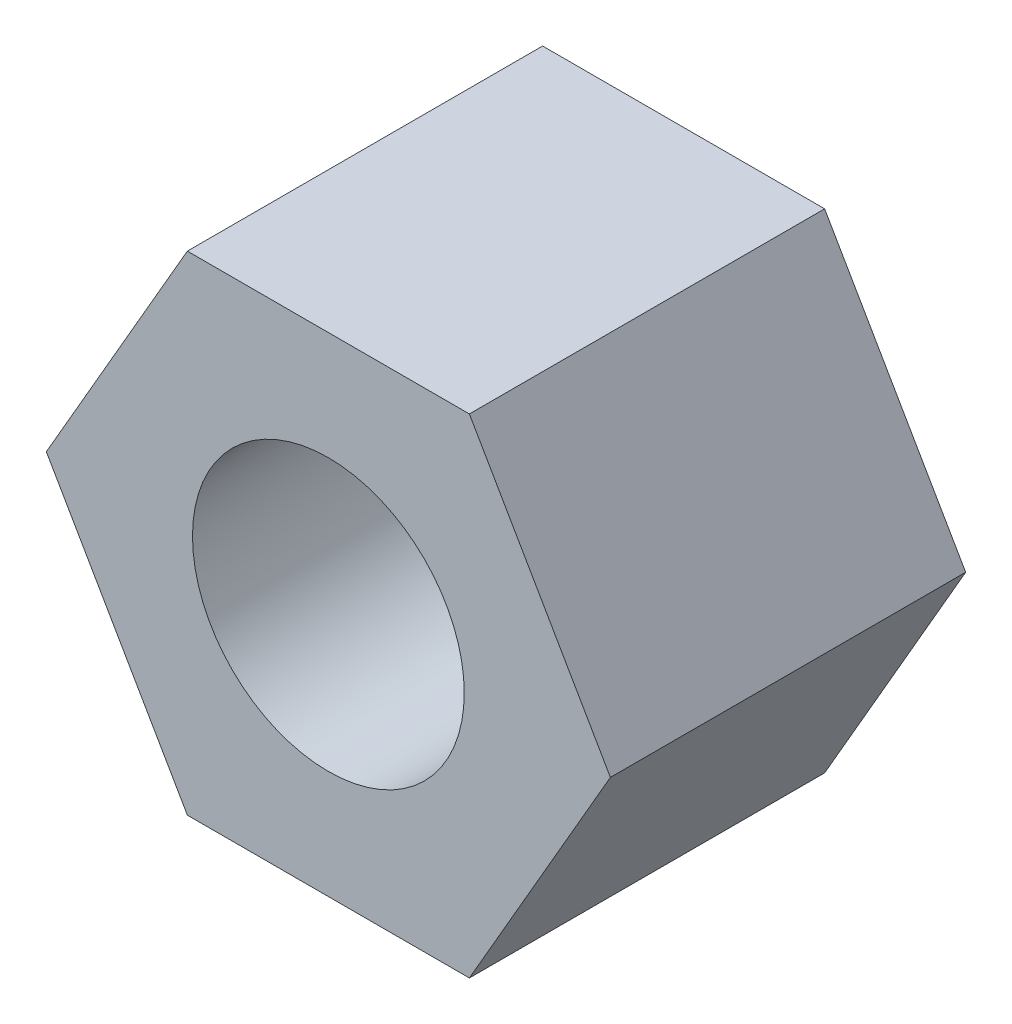
ISO-10303-21;
HEADER;
FILE_DESCRIPTION(('STEP AP214'),'2;1');
FILE_NAME('part.step','',(''),(''),'','','');
FILE_SCHEMA(('AUTOMOTIVE_DESIGN { 1 0 10303 214 1 1 1 1 }'));
ENDSEC;
DATA;
#1=APPLICATION_CONTEXT('core data for automotive mechanical design processes');
#2=APPLICATION_PROTOCOL_DEFINITION('international standard','automotive_design',2000,#1);
#3=PRODUCT_CONTEXT('',#1,'mechanical');
#4=PRODUCT('Part','Part','',(#3));
#5=PRODUCT_RELATED_PRODUCT_CATEGORY('part','',(#4));
#6=PRODUCT_DEFINITION_FORMATION('','',#4);
#7=PRODUCT_DEFINITION_CONTEXT('part definition',#1,'design');
#8=PRODUCT_DEFINITION('design','',#6,#7);
#9=PRODUCT_DEFINITION_SHAPE('','',#8);
#10=(LENGTH_UNIT() NAMED_UNIT(*) SI_UNIT(.MILLI.,.METRE.));
#11=(NAMED_UNIT(*) PLANE_ANGLE_UNIT() SI_UNIT($,.RADIAN.));
#12=(NAMED_UNIT(*) SI_UNIT($,.STERADIAN.) SOLID_ANGLE_UNIT());
#13=UNCERTAINTY_MEASURE_WITH_UNIT(LENGTH_MEASURE(1.E-05),#10,'distance_accuracy_value','');
#14=(GEOMETRIC_REPRESENTATION_CONTEXT(3) GLOBAL_UNCERTAINTY_ASSIGNED_CONTEXT((#13)) GLOBAL_UNIT_ASSIGNED_CONTEXT((#10,
#11,#12)) REPRESENTATION_CONTEXT('',''));
#15=CARTESIAN_POINT('',(0.,0.,0.));
#16=DIRECTION('',(0.,0.,1.));
#17=DIRECTION('',(1.,0.,0.));
#18=AXIS2_PLACEMENT_3D('',#15,#16,#17);
#19=CARTESIAN_POINT('',(0.,0.,4.));
#20=DIRECTION('',(0.,0.,1.));
#21=DIRECTION('',(1.,0.,0.));
#22=AXIS2_PLACEMENT_3D('',#19,#20,#21);
#23=PLANE('',#22);
#24=DIRECTION('',(0.5,0.866025403784438,0.));
#25=VECTOR('',#24,1.);
#26=CARTESIAN_POINT('',(1.58771324027147,-2.75,4.));
#27=LINE('',#26,#25);
#28=CARTESIAN_POINT('',(1.58771324027147,-2.75,4.));
#29=VERTEX_POINT('',#28);
#30=CARTESIAN_POINT('',(3.17542648054294,0.,4.));
#31=VERTEX_POINT('',#30);
#32=EDGE_CURVE('E132',#29,#31,#27,.T.);
#33=ORIENTED_EDGE('',*,*,#32,.T.);
#34=DIRECTION('',(-0.5,0.866025403784438,0.));
#35=VECTOR('',#34,1.);
#36=CARTESIAN_POINT('',(3.17542648054294,0.,4.));
#37=LINE('',#36,#35);
#38=CARTESIAN_POINT('',(1.58771324027147,2.75,4.));
#39=VERTEX_POINT('',#38);
#40=EDGE_CURVE('E91',#31,#39,#37,.T.);
#41=ORIENTED_EDGE('',*,*,#40,.T.);
#42=DIRECTION('',(-1.,0.,0.));
#43=VECTOR('',#42,1.);
#44=CARTESIAN_POINT('',(1.58771324027147,2.75,4.));
#45=LINE('',#44,#43);
#46=CARTESIAN_POINT('',(-1.58771324027147,2.75,4.));
#47=VERTEX_POINT('',#46);
#48=EDGE_CURVE('E106',#39,#47,#45,.T.);
#49=ORIENTED_EDGE('',*,*,#48,.T.);
#50=DIRECTION('',(-0.5,-0.866025403784439,0.));
#51=VECTOR('',#50,1.);
#52=CARTESIAN_POINT('',(-1.58771324027147,2.75,4.));
#53=LINE('',#52,#51);
#54=CARTESIAN_POINT('',(-3.17542648054294,0.,4.));
#55=VERTEX_POINT('',#54);
#56=EDGE_CURVE('E99',#47,#55,#53,.T.);
#57=ORIENTED_EDGE('',*,*,#56,.T.);
#58=DIRECTION('',(0.5,-0.866025403784439,0.));
#59=VECTOR('',#58,1.);
#60=CARTESIAN_POINT('',(-3.17542648054294,0.,4.));
#61=LINE('',#60,#59);
#62=CARTESIAN_POINT('',(-1.58771324027147,-2.75,4.));
#63=VERTEX_POINT('',#62);
#64=EDGE_CURVE('E102',#55,#63,#61,.T.);
#65=ORIENTED_EDGE('',*,*,#64,.T.);
#66=DIRECTION('',(1.,0.,0.));
#67=VECTOR('',#66,1.);
#68=CARTESIAN_POINT('',(-1.58771324027147,-2.75,4.));
#69=LINE('',#68,#67);
#70=EDGE_CURVE('E57',#63,#29,#69,.T.);
#71=ORIENTED_EDGE('',*,*,#70,.T.);
#72=EDGE_LOOP('',(#33,#41,#49,#57,#65,#71));
#73=FACE_BOUND('',#72,.T.);
#74=CARTESIAN_POINT('',(0.,0.,4.));
#75=DIRECTION('',(0.,0.,1.));
#76=DIRECTION('',(1.,0.,0.));
#77=AXIS2_PLACEMENT_3D('',#74,#75,#76);
#78=CIRCLE('',#77,1.53);
#79=CARTESIAN_POINT('',(1.53,0.,4.));
#80=VERTEX_POINT('',#79);
#81=EDGE_CURVE('E126',#80,#80,#78,.T.);
#82=ORIENTED_EDGE('',*,*,#81,.F.);
#83=EDGE_LOOP('',(#82));
#84=FACE_BOUND('',#83,.T.);
#85=ADVANCED_FACE('F39',(#73,#84),#23,.T.);
#86=CARTESIAN_POINT('',(0.,0.,0.));
#87=DIRECTION('',(0.,0.,1.));
#88=DIRECTION('',(1.,0.,0.));
#89=AXIS2_PLACEMENT_3D('',#86,#87,#88);
#90=PLANE('',#89);
#91=DIRECTION('',(0.5,0.866025403784438,0.));
#92=VECTOR('',#91,1.);
#93=CARTESIAN_POINT('',(1.58771324027147,-2.75,0.));
#94=LINE('',#93,#92);
#95=CARTESIAN_POINT('',(1.58771324027147,-2.75,0.));
#96=VERTEX_POINT('',#95);
#97=CARTESIAN_POINT('',(3.17542648054294,0.,0.));
#98=VERTEX_POINT('',#97);
#99=EDGE_CURVE('E121',#96,#98,#94,.T.);
#100=ORIENTED_EDGE('',*,*,#99,.F.);
#101=DIRECTION('',(1.,0.,0.));
#102=VECTOR('',#101,1.);
#103=CARTESIAN_POINT('',(-1.58771324027147,-2.75,0.));
#104=LINE('',#103,#102);
#105=CARTESIAN_POINT('',(-1.58771324027147,-2.75,0.));
#106=VERTEX_POINT('',#105);
#107=EDGE_CURVE('E83',#106,#96,#104,.T.);
#108=ORIENTED_EDGE('',*,*,#107,.F.);
#109=DIRECTION('',(0.5,-0.866025403784439,0.));
#110=VECTOR('',#109,1.);
#111=CARTESIAN_POINT('',(-3.17542648054294,0.,0.));
#112=LINE('',#111,#110);
#113=CARTESIAN_POINT('',(-3.17542648054294,0.,0.));
#114=VERTEX_POINT('',#113);
#115=EDGE_CURVE('E79',#114,#106,#112,.T.);
#116=ORIENTED_EDGE('',*,*,#115,.F.);
#117=DIRECTION('',(-0.5,-0.866025403784439,0.));
#118=VECTOR('',#117,1.);
#119=CARTESIAN_POINT('',(-1.58771324027147,2.75,0.));
#120=LINE('',#119,#118);
#121=CARTESIAN_POINT('',(-1.58771324027147,2.75,0.));
#122=VERTEX_POINT('',#121);
#123=EDGE_CURVE('E111',#122,#114,#120,.T.);
#124=ORIENTED_EDGE('',*,*,#123,.F.);
#125=DIRECTION('',(-1.,0.,0.));
#126=VECTOR('',#125,1.);
#127=CARTESIAN_POINT('',(1.58771324027147,2.75,0.));
#128=LINE('',#127,#126);
#129=CARTESIAN_POINT('',(1.58771324027147,2.75,0.));
#130=VERTEX_POINT('',#129);
#131=EDGE_CURVE('E128',#130,#122,#128,.T.);
#132=ORIENTED_EDGE('',*,*,#131,.F.);
#133=DIRECTION('',(-0.5,0.866025403784438,0.));
#134=VECTOR('',#133,1.);
#135=CARTESIAN_POINT('',(3.17542648054294,0.,0.));
#136=LINE('',#135,#134);
#137=EDGE_CURVE('E130',#98,#130,#136,.T.);
#138=ORIENTED_EDGE('',*,*,#137,.F.);
#139=EDGE_LOOP('',(#100,#108,#116,#124,#132,#138));
#140=FACE_BOUND('',#139,.T.);
#141=CARTESIAN_POINT('',(0.,0.,0.));
#142=DIRECTION('',(0.,0.,1.));
#143=DIRECTION('',(1.,0.,0.));
#144=AXIS2_PLACEMENT_3D('',#141,#142,#143);
#145=CIRCLE('',#144,1.53);
#146=CARTESIAN_POINT('',(1.53,0.,0.));
#147=VERTEX_POINT('',#146);
#148=EDGE_CURVE('E226',#147,#147,#145,.T.);
#149=ORIENTED_EDGE('',*,*,#148,.T.);
#150=EDGE_LOOP('',(#149));
#151=FACE_BOUND('',#150,.T.);
#152=ADVANCED_FACE('F145',(#140,#151),#90,.F.);
#153=CARTESIAN_POINT('',(1.58771324027147,-2.75,4.));
#154=DIRECTION('',(-0.866025403784439,0.5,0.));
#155=DIRECTION('',(-0.5,-0.866025403784439,0.));
#156=AXIS2_PLACEMENT_3D('',#153,#154,#155);
#157=PLANE('',#156);
#158=ORIENTED_EDGE('',*,*,#99,.T.);
#159=DIRECTION('',(0.,0.,-1.));
#160=VECTOR('',#159,1.);
#161=CARTESIAN_POINT('',(3.17542648054294,0.,4.));
#162=LINE('',#161,#160);
#163=EDGE_CURVE('E11',#31,#98,#162,.T.);
#164=ORIENTED_EDGE('',*,*,#163,.F.);
#165=ORIENTED_EDGE('',*,*,#32,.F.);
#166=DIRECTION('',(0.,0.,-1.));
#167=VECTOR('',#166,1.);
#168=CARTESIAN_POINT('',(1.58771324027147,-2.75,4.));
#169=LINE('',#168,#167);
#170=EDGE_CURVE('E117',#29,#96,#169,.T.);
#171=ORIENTED_EDGE('',*,*,#170,.T.);
#172=EDGE_LOOP('',(#158,#164,#165,#171));
#173=FACE_BOUND('',#172,.T.);
#174=ADVANCED_FACE('F41',(#173),#157,.F.);
#175=CARTESIAN_POINT('',(3.17542648054294,0.,4.));
#176=DIRECTION('',(-0.866025403784439,-0.5,0.));
#177=DIRECTION('',(0.5,-0.866025403784439,0.));
#178=AXIS2_PLACEMENT_3D('',#175,#176,#177);
#179=PLANE('',#178);
#180=ORIENTED_EDGE('',*,*,#137,.T.);
#181=DIRECTION('',(0.,0.,-1.));
#182=VECTOR('',#181,1.);
#183=CARTESIAN_POINT('',(1.58771324027147,2.75,4.));
#184=LINE('',#183,#182);
#185=EDGE_CURVE('E48',#39,#130,#184,.T.);
#186=ORIENTED_EDGE('',*,*,#185,.F.);
#187=ORIENTED_EDGE('',*,*,#40,.F.);
#188=ORIENTED_EDGE('',*,*,#163,.T.);
#189=EDGE_LOOP('',(#180,#186,#187,#188));
#190=FACE_BOUND('',#189,.T.);
#191=ADVANCED_FACE('F166',(#190),#179,.F.);
#192=CARTESIAN_POINT('',(1.58771324027147,2.75,4.));
#193=DIRECTION('',(0.,-1.,0.));
#194=DIRECTION('',(1.,0.,0.));
#195=AXIS2_PLACEMENT_3D('',#192,#193,#194);
#196=PLANE('',#195);
#197=ORIENTED_EDGE('',*,*,#131,.T.);
#198=DIRECTION('',(0.,0.,-1.));
#199=VECTOR('',#198,1.);
#200=CARTESIAN_POINT('',(-1.58771324027147,2.75,4.));
#201=LINE('',#200,#199);
#202=EDGE_CURVE('E113',#47,#122,#201,.T.);
#203=ORIENTED_EDGE('',*,*,#202,.F.);
#204=ORIENTED_EDGE('',*,*,#48,.F.);
#205=ORIENTED_EDGE('',*,*,#185,.T.);
#206=EDGE_LOOP('',(#197,#203,#204,#205));
#207=FACE_BOUND('',#206,.T.);
#208=ADVANCED_FACE('F143',(#207),#196,.F.);
#209=CARTESIAN_POINT('',(-1.58771324027147,2.75,4.));
#210=DIRECTION('',(0.866025403784439,-0.5,0.));
#211=DIRECTION('',(0.5,0.866025403784439,0.));
#212=AXIS2_PLACEMENT_3D('',#209,#210,#211);
#213=PLANE('',#212);
#214=ORIENTED_EDGE('',*,*,#123,.T.);
#215=DIRECTION('',(0.,0.,-1.));
#216=VECTOR('',#215,1.);
#217=CARTESIAN_POINT('',(-3.17542648054294,0.,4.));
#218=LINE('',#217,#216);
#219=EDGE_CURVE('E112',#55,#114,#218,.T.);
#220=ORIENTED_EDGE('',*,*,#219,.F.);
#221=ORIENTED_EDGE('',*,*,#56,.F.);
#222=ORIENTED_EDGE('',*,*,#202,.T.);
#223=EDGE_LOOP('',(#214,#220,#221,#222));
#224=FACE_BOUND('',#223,.T.);
#225=ADVANCED_FACE('F115',(#224),#213,.F.);
#226=CARTESIAN_POINT('',(-3.17542648054294,0.,4.));
#227=DIRECTION('',(0.866025403784439,0.5,0.));
#228=DIRECTION('',(-0.5,0.866025403784439,0.));
#229=AXIS2_PLACEMENT_3D('',#226,#227,#228);
#230=PLANE('',#229);
#231=ORIENTED_EDGE('',*,*,#115,.T.);
#232=DIRECTION('',(0.,0.,-1.));
#233=VECTOR('',#232,1.);
#234=CARTESIAN_POINT('',(-1.58771324027147,-2.75,4.));
#235=LINE('',#234,#233);
#236=EDGE_CURVE('E118',#63,#106,#235,.T.);
#237=ORIENTED_EDGE('',*,*,#236,.F.);
#238=ORIENTED_EDGE('',*,*,#64,.F.);
#239=ORIENTED_EDGE('',*,*,#219,.T.);
#240=EDGE_LOOP('',(#231,#237,#238,#239));
#241=FACE_BOUND('',#240,.T.);
#242=ADVANCED_FACE('F116',(#241),#230,.F.);
#243=CARTESIAN_POINT('',(-1.58771324027147,-2.75,4.));
#244=DIRECTION('',(0.,1.,0.));
#245=DIRECTION('',(-1.,0.,0.));
#246=AXIS2_PLACEMENT_3D('',#243,#244,#245);
#247=PLANE('',#246);
#248=ORIENTED_EDGE('',*,*,#107,.T.);
#249=ORIENTED_EDGE('',*,*,#170,.F.);
#250=ORIENTED_EDGE('',*,*,#70,.F.);
#251=ORIENTED_EDGE('',*,*,#236,.T.);
#252=EDGE_LOOP('',(#248,#249,#250,#251));
#253=FACE_BOUND('',#252,.T.);
#254=ADVANCED_FACE('F149',(#253),#247,.F.);
#255=CARTESIAN_POINT('',(0.,0.,4.));
#256=DIRECTION('',(0.,0.,-1.));
#257=DIRECTION('',(-1.,0.,0.));
#258=AXIS2_PLACEMENT_3D('',#255,#256,#257);
#259=CYLINDRICAL_SURFACE('',#258,1.53);
#260=ORIENTED_EDGE('',*,*,#81,.T.);
#261=EDGE_LOOP('',(#260));
#262=FACE_BOUND('',#261,.T.);
#263=ORIENTED_EDGE('',*,*,#148,.F.);
#264=EDGE_LOOP('',(#263));
#265=FACE_BOUND('',#264,.T.);
#266=ADVANCED_FACE('F151',(#262,#265),#259,.F.);
#267=CLOSED_SHELL('',(#85,#152,#174,#191,#208,#225,#242,#254,#266));
#268=MANIFOLD_SOLID_BREP('B2',#267);
#269=ADVANCED_BREP_SHAPE_REPRESENTATION('',(#18,#268),#14);
#270=SHAPE_DEFINITION_REPRESENTATION(#9,#269);
ENDSEC;
END-ISO-10303-21;
